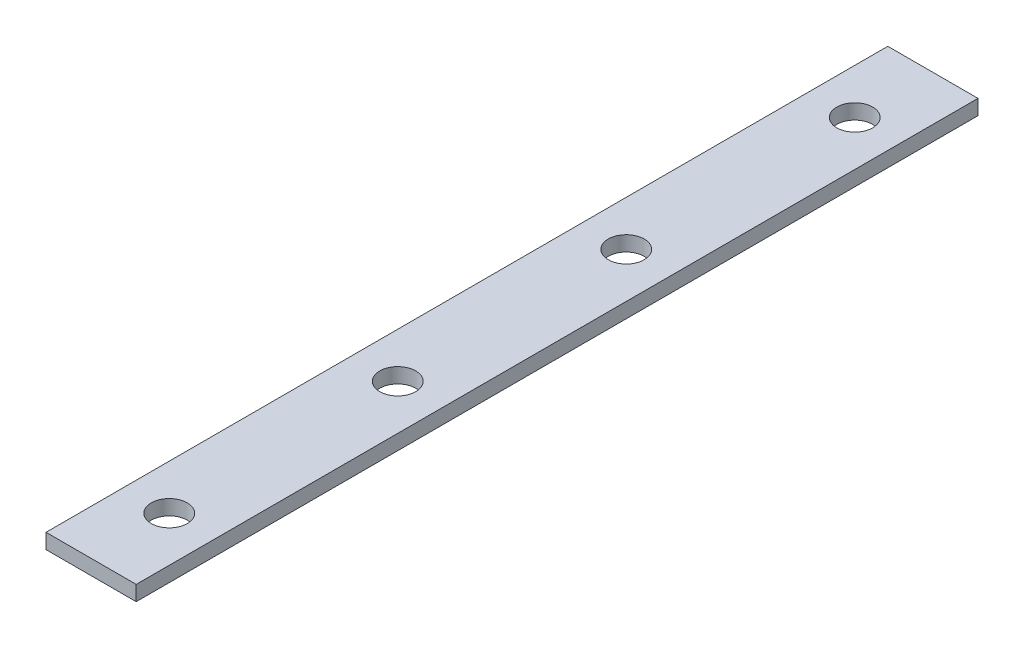
ISO-10303-21;
HEADER;
FILE_DESCRIPTION(('STEP AP214'),'2;1');
FILE_NAME('part.step','',(''),(''),'','','');
FILE_SCHEMA(('AUTOMOTIVE_DESIGN { 1 0 10303 214 1 1 1 1 }'));
ENDSEC;
DATA;
#1=APPLICATION_CONTEXT('core data for automotive mechanical design processes');
#2=APPLICATION_PROTOCOL_DEFINITION('international standard','automotive_design',2000,#1);
#3=PRODUCT_CONTEXT('',#1,'mechanical');
#4=PRODUCT('Part','Part','',(#3));
#5=PRODUCT_RELATED_PRODUCT_CATEGORY('part','',(#4));
#6=PRODUCT_DEFINITION_FORMATION('','',#4);
#7=PRODUCT_DEFINITION_CONTEXT('part definition',#1,'design');
#8=PRODUCT_DEFINITION('design','',#6,#7);
#9=PRODUCT_DEFINITION_SHAPE('','',#8);
#10=(LENGTH_UNIT() NAMED_UNIT(*) SI_UNIT(.MILLI.,.METRE.));
#11=(NAMED_UNIT(*) PLANE_ANGLE_UNIT() SI_UNIT($,.RADIAN.));
#12=(NAMED_UNIT(*) SI_UNIT($,.STERADIAN.) SOLID_ANGLE_UNIT());
#13=UNCERTAINTY_MEASURE_WITH_UNIT(LENGTH_MEASURE(1.E-05),#10,'distance_accuracy_value','');
#14=(GEOMETRIC_REPRESENTATION_CONTEXT(3) GLOBAL_UNCERTAINTY_ASSIGNED_CONTEXT((#13)) GLOBAL_UNIT_ASSIGNED_CONTEXT((#10,
#11,#12)) REPRESENTATION_CONTEXT('',''));
#15=CARTESIAN_POINT('',(0.,0.,0.));
#16=DIRECTION('',(0.,0.,1.));
#17=DIRECTION('',(1.,0.,0.));
#18=AXIS2_PLACEMENT_3D('',#15,#16,#17);
#19=CARTESIAN_POINT('',(0.,1.5875,0.));
#20=DIRECTION('',(0.,-1.,0.));
#21=DIRECTION('',(0.,0.,-1.));
#22=AXIS2_PLACEMENT_3D('',#19,#20,#21);
#23=PLANE('',#22);
#24=DIRECTION('',(0.,0.,1.));
#25=VECTOR('',#24,1.);
#26=CARTESIAN_POINT('',(0.,1.5875,0.));
#27=LINE('',#26,#25);
#28=CARTESIAN_POINT('',(0.,1.5875,-88.9));
#29=VERTEX_POINT('',#28);
#30=CARTESIAN_POINT('',(0.,1.5875,0.));
#31=VERTEX_POINT('',#30);
#32=EDGE_CURVE('E95',#29,#31,#27,.T.);
#33=ORIENTED_EDGE('',*,*,#32,.T.);
#34=DIRECTION('',(1.,0.,0.));
#35=VECTOR('',#34,1.);
#36=CARTESIAN_POINT('',(0.,1.5875,0.));
#37=LINE('',#36,#35);
#38=CARTESIAN_POINT('',(9.525,1.5875,0.));
#39=VERTEX_POINT('',#38);
#40=EDGE_CURVE('E90',#31,#39,#37,.T.);
#41=ORIENTED_EDGE('',*,*,#40,.T.);
#42=DIRECTION('',(0.,0.,-1.));
#43=VECTOR('',#42,1.);
#44=CARTESIAN_POINT('',(9.525,1.5875,0.));
#45=LINE('',#44,#43);
#46=CARTESIAN_POINT('',(9.525,1.5875,-88.9));
#47=VERTEX_POINT('',#46);
#48=EDGE_CURVE('E93',#39,#47,#45,.T.);
#49=ORIENTED_EDGE('',*,*,#48,.T.);
#50=DIRECTION('',(-1.,0.,0.));
#51=VECTOR('',#50,1.);
#52=CARTESIAN_POINT('',(0.,1.5875,-88.9));
#53=LINE('',#52,#51);
#54=EDGE_CURVE('E60',#47,#29,#53,.T.);
#55=ORIENTED_EDGE('',*,*,#54,.T.);
#56=EDGE_LOOP('',(#33,#41,#49,#55));
#57=FACE_BOUND('',#56,.T.);
#58=CARTESIAN_POINT('',(4.7625,1.5875,-8.255));
#59=DIRECTION('',(0.,1.,0.));
#60=DIRECTION('',(0.,0.,1.));
#61=AXIS2_PLACEMENT_3D('',#58,#59,#60);
#62=CIRCLE('',#61,1.89865);
#63=CARTESIAN_POINT('',(4.7625,1.5875,-6.35635));
#64=VERTEX_POINT('',#63);
#65=EDGE_CURVE('E110',#64,#64,#62,.T.);
#66=ORIENTED_EDGE('',*,*,#65,.F.);
#67=EDGE_LOOP('',(#66));
#68=FACE_BOUND('',#67,.T.);
#69=CARTESIAN_POINT('',(4.7625,1.5875,-32.385));
#70=DIRECTION('',(0.,1.,0.));
#71=DIRECTION('',(0.,0.,1.));
#72=AXIS2_PLACEMENT_3D('',#69,#70,#71);
#73=CIRCLE('',#72,1.89865);
#74=CARTESIAN_POINT('',(4.7625,1.5875,-30.48635));
#75=VERTEX_POINT('',#74);
#76=EDGE_CURVE('E125',#75,#75,#73,.T.);
#77=ORIENTED_EDGE('',*,*,#76,.F.);
#78=EDGE_LOOP('',(#77));
#79=FACE_BOUND('',#78,.T.);
#80=CARTESIAN_POINT('',(4.7625,1.5875,-56.515));
#81=DIRECTION('',(0.,1.,0.));
#82=DIRECTION('',(0.,0.,1.));
#83=AXIS2_PLACEMENT_3D('',#80,#81,#82);
#84=CIRCLE('',#83,1.89865);
#85=CARTESIAN_POINT('',(4.7625,1.5875,-54.61635));
#86=VERTEX_POINT('',#85);
#87=EDGE_CURVE('E131',#86,#86,#84,.T.);
#88=ORIENTED_EDGE('',*,*,#87,.F.);
#89=EDGE_LOOP('',(#88));
#90=FACE_BOUND('',#89,.T.);
#91=CARTESIAN_POINT('',(4.7625,1.5875,-80.645));
#92=DIRECTION('',(0.,1.,0.));
#93=DIRECTION('',(0.,0.,1.));
#94=AXIS2_PLACEMENT_3D('',#91,#92,#93);
#95=CIRCLE('',#94,1.89865);
#96=CARTESIAN_POINT('',(4.7625,1.5875,-78.74635));
#97=VERTEX_POINT('',#96);
#98=EDGE_CURVE('E137',#97,#97,#95,.T.);
#99=ORIENTED_EDGE('',*,*,#98,.F.);
#100=EDGE_LOOP('',(#99));
#101=FACE_BOUND('',#100,.T.);
#102=ADVANCED_FACE('F43',(#57,#68,#79,#90,#101),#23,.F.);
#103=CARTESIAN_POINT('',(0.,0.,0.));
#104=DIRECTION('',(0.,-1.,0.));
#105=DIRECTION('',(0.,0.,-1.));
#106=AXIS2_PLACEMENT_3D('',#103,#104,#105);
#107=PLANE('',#106);
#108=CARTESIAN_POINT('',(4.7625,0.,-56.515));
#109=DIRECTION('',(0.,1.,0.));
#110=DIRECTION('',(0.,0.,1.));
#111=AXIS2_PLACEMENT_3D('',#108,#109,#110);
#112=CIRCLE('',#111,1.89865);
#113=CARTESIAN_POINT('',(4.7625,0.,-54.61635));
#114=VERTEX_POINT('',#113);
#115=EDGE_CURVE('E134',#114,#114,#112,.T.);
#116=ORIENTED_EDGE('',*,*,#115,.T.);
#117=EDGE_LOOP('',(#116));
#118=FACE_BOUND('',#117,.T.);
#119=CARTESIAN_POINT('',(4.7625,0.,-8.255));
#120=DIRECTION('',(0.,1.,0.));
#121=DIRECTION('',(0.,0.,1.));
#122=AXIS2_PLACEMENT_3D('',#119,#120,#121);
#123=CIRCLE('',#122,1.89865);
#124=CARTESIAN_POINT('',(4.7625,0.,-6.35635));
#125=VERTEX_POINT('',#124);
#126=EDGE_CURVE('E122',#125,#125,#123,.T.);
#127=ORIENTED_EDGE('',*,*,#126,.T.);
#128=EDGE_LOOP('',(#127));
#129=FACE_BOUND('',#128,.T.);
#130=DIRECTION('',(0.,0.,1.));
#131=VECTOR('',#130,1.);
#132=CARTESIAN_POINT('',(0.,0.,0.));
#133=LINE('',#132,#131);
#134=CARTESIAN_POINT('',(0.,0.,-88.9));
#135=VERTEX_POINT('',#134);
#136=CARTESIAN_POINT('',(0.,0.,0.));
#137=VERTEX_POINT('',#136);
#138=EDGE_CURVE('E107',#135,#137,#133,.T.);
#139=ORIENTED_EDGE('',*,*,#138,.F.);
#140=DIRECTION('',(-1.,0.,0.));
#141=VECTOR('',#140,1.);
#142=CARTESIAN_POINT('',(0.,0.,-88.9));
#143=LINE('',#142,#141);
#144=CARTESIAN_POINT('',(9.525,0.,-88.9));
#145=VERTEX_POINT('',#144);
#146=EDGE_CURVE('E83',#145,#135,#143,.T.);
#147=ORIENTED_EDGE('',*,*,#146,.F.);
#148=DIRECTION('',(0.,0.,-1.));
#149=VECTOR('',#148,1.);
#150=CARTESIAN_POINT('',(9.525,0.,0.));
#151=LINE('',#150,#149);
#152=CARTESIAN_POINT('',(9.525,0.,0.));
#153=VERTEX_POINT('',#152);
#154=EDGE_CURVE('E77',#153,#145,#151,.T.);
#155=ORIENTED_EDGE('',*,*,#154,.F.);
#156=DIRECTION('',(1.,0.,0.));
#157=VECTOR('',#156,1.);
#158=CARTESIAN_POINT('',(0.,0.,0.));
#159=LINE('',#158,#157);
#160=EDGE_CURVE('E99',#137,#153,#159,.T.);
#161=ORIENTED_EDGE('',*,*,#160,.F.);
#162=EDGE_LOOP('',(#139,#147,#155,#161));
#163=FACE_BOUND('',#162,.T.);
#164=CARTESIAN_POINT('',(4.7625,0.,-32.385));
#165=DIRECTION('',(0.,1.,0.));
#166=DIRECTION('',(0.,0.,1.));
#167=AXIS2_PLACEMENT_3D('',#164,#165,#166);
#168=CIRCLE('',#167,1.89865);
#169=CARTESIAN_POINT('',(4.7625,0.,-30.48635));
#170=VERTEX_POINT('',#169);
#171=EDGE_CURVE('E128',#170,#170,#168,.T.);
#172=ORIENTED_EDGE('',*,*,#171,.T.);
#173=EDGE_LOOP('',(#172));
#174=FACE_BOUND('',#173,.T.);
#175=CARTESIAN_POINT('',(4.7625,0.,-80.645));
#176=DIRECTION('',(0.,1.,0.));
#177=DIRECTION('',(0.,0.,1.));
#178=AXIS2_PLACEMENT_3D('',#175,#176,#177);
#179=CIRCLE('',#178,1.89865);
#180=CARTESIAN_POINT('',(4.7625,0.,-78.74635));
#181=VERTEX_POINT('',#180);
#182=EDGE_CURVE('E140',#181,#181,#179,.T.);
#183=ORIENTED_EDGE('',*,*,#182,.T.);
#184=EDGE_LOOP('',(#183));
#185=FACE_BOUND('',#184,.T.);
#186=ADVANCED_FACE('F118',(#118,#129,#163,#174,#185),#107,.T.);
#187=CARTESIAN_POINT('',(0.,1.5875,0.));
#188=DIRECTION('',(1.,0.,0.));
#189=DIRECTION('',(0.,0.,-1.));
#190=AXIS2_PLACEMENT_3D('',#187,#188,#189);
#191=PLANE('',#190);
#192=ORIENTED_EDGE('',*,*,#138,.T.);
#193=DIRECTION('',(0.,-1.,0.));
#194=VECTOR('',#193,1.);
#195=CARTESIAN_POINT('',(0.,1.5875,0.));
#196=LINE('',#195,#194);
#197=EDGE_CURVE('E13',#31,#137,#196,.T.);
#198=ORIENTED_EDGE('',*,*,#197,.F.);
#199=ORIENTED_EDGE('',*,*,#32,.F.);
#200=DIRECTION('',(0.,-1.,0.));
#201=VECTOR('',#200,1.);
#202=CARTESIAN_POINT('',(0.,1.5875,-88.9));
#203=LINE('',#202,#201);
#204=EDGE_CURVE('E103',#29,#135,#203,.T.);
#205=ORIENTED_EDGE('',*,*,#204,.T.);
#206=EDGE_LOOP('',(#192,#198,#199,#205));
#207=FACE_BOUND('',#206,.T.);
#208=ADVANCED_FACE('F45',(#207),#191,.F.);
#209=CARTESIAN_POINT('',(0.,1.5875,0.));
#210=DIRECTION('',(0.,0.,-1.));
#211=DIRECTION('',(-1.,0.,0.));
#212=AXIS2_PLACEMENT_3D('',#209,#210,#211);
#213=PLANE('',#212);
#214=ORIENTED_EDGE('',*,*,#160,.T.);
#215=DIRECTION('',(0.,-1.,0.));
#216=VECTOR('',#215,1.);
#217=CARTESIAN_POINT('',(9.525,1.5875,0.));
#218=LINE('',#217,#216);
#219=EDGE_CURVE('E52',#39,#153,#218,.T.);
#220=ORIENTED_EDGE('',*,*,#219,.F.);
#221=ORIENTED_EDGE('',*,*,#40,.F.);
#222=ORIENTED_EDGE('',*,*,#197,.T.);
#223=EDGE_LOOP('',(#214,#220,#221,#222));
#224=FACE_BOUND('',#223,.T.);
#225=ADVANCED_FACE('F98',(#224),#213,.F.);
#226=CARTESIAN_POINT('',(9.525,1.5875,0.));
#227=DIRECTION('',(-1.,0.,0.));
#228=DIRECTION('',(0.,0.,1.));
#229=AXIS2_PLACEMENT_3D('',#226,#227,#228);
#230=PLANE('',#229);
#231=ORIENTED_EDGE('',*,*,#154,.T.);
#232=DIRECTION('',(0.,-1.,0.));
#233=VECTOR('',#232,1.);
#234=CARTESIAN_POINT('',(9.525,1.5875,-88.9));
#235=LINE('',#234,#233);
#236=EDGE_CURVE('E100',#47,#145,#235,.T.);
#237=ORIENTED_EDGE('',*,*,#236,.F.);
#238=ORIENTED_EDGE('',*,*,#48,.F.);
#239=ORIENTED_EDGE('',*,*,#219,.T.);
#240=EDGE_LOOP('',(#231,#237,#238,#239));
#241=FACE_BOUND('',#240,.T.);
#242=ADVANCED_FACE('F101',(#241),#230,.F.);
#243=CARTESIAN_POINT('',(0.,1.5875,-88.9));
#244=DIRECTION('',(0.,0.,1.));
#245=DIRECTION('',(1.,0.,0.));
#246=AXIS2_PLACEMENT_3D('',#243,#244,#245);
#247=PLANE('',#246);
#248=ORIENTED_EDGE('',*,*,#146,.T.);
#249=ORIENTED_EDGE('',*,*,#204,.F.);
#250=ORIENTED_EDGE('',*,*,#54,.F.);
#251=ORIENTED_EDGE('',*,*,#236,.T.);
#252=EDGE_LOOP('',(#248,#249,#250,#251));
#253=FACE_BOUND('',#252,.T.);
#254=ADVANCED_FACE('F115',(#253),#247,.F.);
#255=CARTESIAN_POINT('',(4.7625,1.5875,-8.255));
#256=DIRECTION('',(0.,-1.,0.));
#257=DIRECTION('',(0.,0.,-1.));
#258=AXIS2_PLACEMENT_3D('',#255,#256,#257);
#259=CYLINDRICAL_SURFACE('',#258,1.89865);
#260=ORIENTED_EDGE('',*,*,#65,.T.);
#261=EDGE_LOOP('',(#260));
#262=FACE_BOUND('',#261,.T.);
#263=ORIENTED_EDGE('',*,*,#126,.F.);
#264=EDGE_LOOP('',(#263));
#265=FACE_BOUND('',#264,.T.);
#266=ADVANCED_FACE('F157',(#262,#265),#259,.F.);
#267=CARTESIAN_POINT('',(4.7625,1.5875,-32.385));
#268=DIRECTION('',(0.,-1.,0.));
#269=DIRECTION('',(0.,0.,-1.));
#270=AXIS2_PLACEMENT_3D('',#267,#268,#269);
#271=CYLINDRICAL_SURFACE('',#270,1.89865);
#272=ORIENTED_EDGE('',*,*,#76,.T.);
#273=EDGE_LOOP('',(#272));
#274=FACE_BOUND('',#273,.T.);
#275=ORIENTED_EDGE('',*,*,#171,.F.);
#276=EDGE_LOOP('',(#275));
#277=FACE_BOUND('',#276,.T.);
#278=ADVANCED_FACE('F203',(#274,#277),#271,.F.);
#279=CARTESIAN_POINT('',(4.7625,1.5875,-56.515));
#280=DIRECTION('',(0.,-1.,0.));
#281=DIRECTION('',(0.,0.,-1.));
#282=AXIS2_PLACEMENT_3D('',#279,#280,#281);
#283=CYLINDRICAL_SURFACE('',#282,1.89865);
#284=ORIENTED_EDGE('',*,*,#87,.T.);
#285=EDGE_LOOP('',(#284));
#286=FACE_BOUND('',#285,.T.);
#287=ORIENTED_EDGE('',*,*,#115,.F.);
#288=EDGE_LOOP('',(#287));
#289=FACE_BOUND('',#288,.T.);
#290=ADVANCED_FACE('F211',(#286,#289),#283,.F.);
#291=CARTESIAN_POINT('',(4.7625,1.5875,-80.645));
#292=DIRECTION('',(0.,-1.,0.));
#293=DIRECTION('',(0.,0.,-1.));
#294=AXIS2_PLACEMENT_3D('',#291,#292,#293);
#295=CYLINDRICAL_SURFACE('',#294,1.89865);
#296=ORIENTED_EDGE('',*,*,#98,.T.);
#297=EDGE_LOOP('',(#296));
#298=FACE_BOUND('',#297,.T.);
#299=ORIENTED_EDGE('',*,*,#182,.F.);
#300=EDGE_LOOP('',(#299));
#301=FACE_BOUND('',#300,.T.);
#302=ADVANCED_FACE('F146',(#298,#301),#295,.F.);
#303=CLOSED_SHELL('',(#102,#186,#208,#225,#242,#254,#266,#278,#290,#302));
#304=MANIFOLD_SOLID_BREP('B2',#303);
#305=ADVANCED_BREP_SHAPE_REPRESENTATION('',(#18,#304),#14);
#306=SHAPE_DEFINITION_REPRESENTATION(#9,#305);
ENDSEC;
END-ISO-10303-21;
